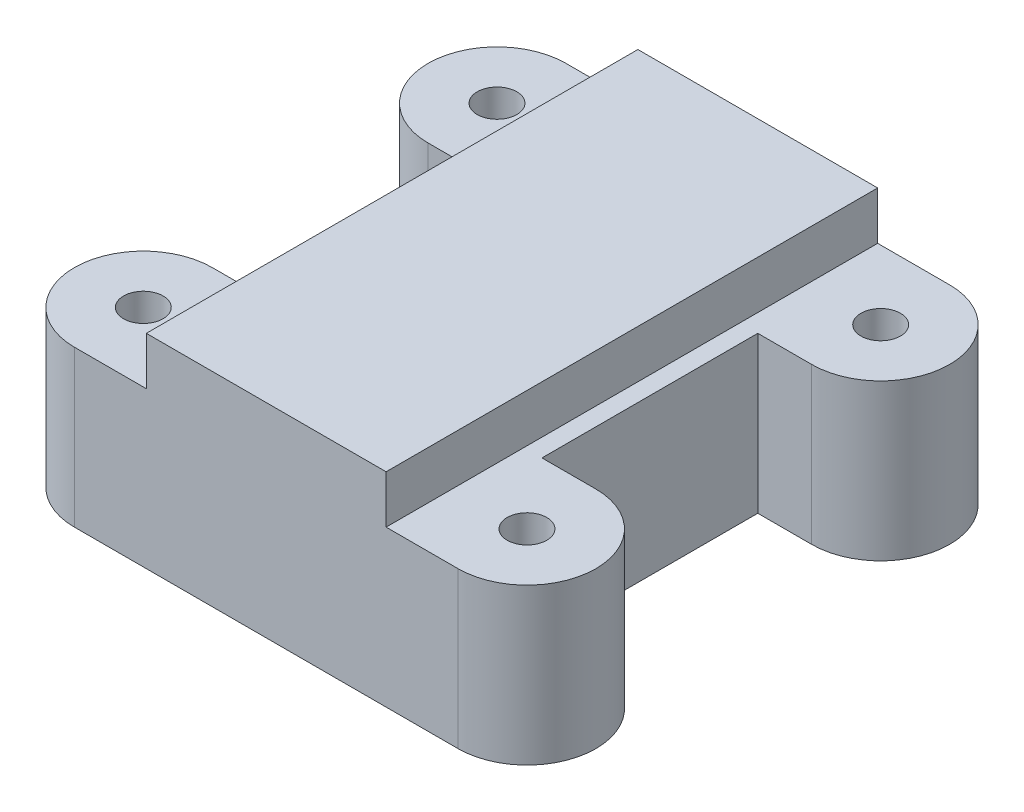
ISO-10303-21;
HEADER;
FILE_DESCRIPTION(('STEP AP214'),'2;1');
FILE_NAME('part.step','',(''),(''),'','','');
FILE_SCHEMA(('AUTOMOTIVE_DESIGN { 1 0 10303 214 1 1 1 1 }'));
ENDSEC;
DATA;
#1=APPLICATION_CONTEXT('core data for automotive mechanical design processes');
#2=APPLICATION_PROTOCOL_DEFINITION('international standard','automotive_design',2000,#1);
#3=PRODUCT_CONTEXT('',#1,'mechanical');
#4=PRODUCT('Part','Part','',(#3));
#5=PRODUCT_RELATED_PRODUCT_CATEGORY('part','',(#4));
#6=PRODUCT_DEFINITION_FORMATION('','',#4);
#7=PRODUCT_DEFINITION_CONTEXT('part definition',#1,'design');
#8=PRODUCT_DEFINITION('design','',#6,#7);
#9=PRODUCT_DEFINITION_SHAPE('','',#8);
#10=(LENGTH_UNIT() NAMED_UNIT(*) SI_UNIT(.MILLI.,.METRE.));
#11=(NAMED_UNIT(*) PLANE_ANGLE_UNIT() SI_UNIT($,.RADIAN.));
#12=(NAMED_UNIT(*) SI_UNIT($,.STERADIAN.) SOLID_ANGLE_UNIT());
#13=UNCERTAINTY_MEASURE_WITH_UNIT(LENGTH_MEASURE(1.E-05),#10,'distance_accuracy_value','');
#14=(GEOMETRIC_REPRESENTATION_CONTEXT(3) GLOBAL_UNCERTAINTY_ASSIGNED_CONTEXT((#13)) GLOBAL_UNIT_ASSIGNED_CONTEXT((#10,
#11,#12)) REPRESENTATION_CONTEXT('',''));
#15=CARTESIAN_POINT('',(0.,0.,0.));
#16=DIRECTION('',(0.,0.,1.));
#17=DIRECTION('',(1.,0.,0.));
#18=AXIS2_PLACEMENT_3D('',#15,#16,#17);
#19=CARTESIAN_POINT('',(-16.,13.,-14.75));
#20=DIRECTION('',(0.,-1.,0.));
#21=DIRECTION('',(0.,0.,-1.));
#22=AXIS2_PLACEMENT_3D('',#19,#20,#21);
#23=PLANE('',#22);
#24=CARTESIAN_POINT('',(-16.,13.,-14.75));
#25=DIRECTION('',(0.,1.,0.));
#26=DIRECTION('',(0.,0.,1.));
#27=AXIS2_PLACEMENT_3D('',#24,#25,#26);
#28=CIRCLE('',#27,1.65);
#29=CARTESIAN_POINT('',(-16.,13.,-16.4));
#30=VERTEX_POINT('',#29);
#31=EDGE_CURVE('E367',#30,#30,#28,.T.);
#32=ORIENTED_EDGE('',*,*,#31,.F.);
#33=EDGE_LOOP('',(#32));
#34=FACE_BOUND('',#33,.T.);
#35=CARTESIAN_POINT('',(-16.,13.,14.75));
#36=DIRECTION('',(0.,-1.,0.));
#37=DIRECTION('',(0.,0.,-1.));
#38=AXIS2_PLACEMENT_3D('',#35,#36,#37);
#39=CIRCLE('',#38,1.65);
#40=CARTESIAN_POINT('',(-16.,13.,13.1));
#41=VERTEX_POINT('',#40);
#42=EDGE_CURVE('E347',#41,#41,#39,.T.);
#43=ORIENTED_EDGE('',*,*,#42,.T.);
#44=EDGE_LOOP('',(#43));
#45=FACE_BOUND('',#44,.T.);
#46=DIRECTION('',(0.,0.,1.));
#47=VECTOR('',#46,1.);
#48=CARTESIAN_POINT('',(-10.,13.,-20.5));
#49=LINE('',#48,#47);
#50=CARTESIAN_POINT('',(-9.99999999999999,13.,-20.5));
#51=VERTEX_POINT('',#50);
#52=CARTESIAN_POINT('',(-9.99999999999999,13.,20.5));
#53=VERTEX_POINT('',#52);
#54=EDGE_CURVE('E209',#51,#53,#49,.T.);
#55=ORIENTED_EDGE('',*,*,#54,.F.);
#56=DIRECTION('',(1.,0.,0.));
#57=VECTOR('',#56,1.);
#58=CARTESIAN_POINT('',(-16.,13.,-20.5));
#59=LINE('',#58,#57);
#60=CARTESIAN_POINT('',(-16.,13.,-20.5));
#61=VERTEX_POINT('',#60);
#62=EDGE_CURVE('E313',#61,#51,#59,.T.);
#63=ORIENTED_EDGE('',*,*,#62,.F.);
#64=CARTESIAN_POINT('',(-16.,13.,-14.75));
#65=DIRECTION('',(0.,-1.,0.));
#66=DIRECTION('',(0.,0.,-1.));
#67=AXIS2_PLACEMENT_3D('',#64,#65,#66);
#68=CIRCLE('',#67,5.75);
#69=CARTESIAN_POINT('',(-16.,13.,-9.));
#70=VERTEX_POINT('',#69);
#71=EDGE_CURVE('E314',#70,#61,#68,.T.);
#72=ORIENTED_EDGE('',*,*,#71,.F.);
#73=DIRECTION('',(1.,0.,0.));
#74=VECTOR('',#73,1.);
#75=CARTESIAN_POINT('',(-16.,13.,-9.));
#76=LINE('',#75,#74);
#77=CARTESIAN_POINT('',(-11.5,13.,-9.));
#78=VERTEX_POINT('',#77);
#79=EDGE_CURVE('E379',#70,#78,#76,.T.);
#80=ORIENTED_EDGE('',*,*,#79,.T.);
#81=DIRECTION('',(0.,0.,1.));
#82=VECTOR('',#81,1.);
#83=CARTESIAN_POINT('',(-11.5,13.,-9.));
#84=LINE('',#83,#82);
#85=CARTESIAN_POINT('',(-11.5,13.,9.));
#86=VERTEX_POINT('',#85);
#87=EDGE_CURVE('E376',#78,#86,#84,.T.);
#88=ORIENTED_EDGE('',*,*,#87,.T.);
#89=DIRECTION('',(1.,0.,0.));
#90=VECTOR('',#89,1.);
#91=CARTESIAN_POINT('',(-16.,13.,9.));
#92=LINE('',#91,#90);
#93=CARTESIAN_POINT('',(-16.,13.,9.));
#94=VERTEX_POINT('',#93);
#95=EDGE_CURVE('E373',#94,#86,#92,.T.);
#96=ORIENTED_EDGE('',*,*,#95,.F.);
#97=CARTESIAN_POINT('',(-16.,13.,14.75));
#98=DIRECTION('',(0.,1.,0.));
#99=DIRECTION('',(0.,0.,1.));
#100=AXIS2_PLACEMENT_3D('',#97,#98,#99);
#101=CIRCLE('',#100,5.75);
#102=CARTESIAN_POINT('',(-16.,13.,20.5));
#103=VERTEX_POINT('',#102);
#104=EDGE_CURVE('E399',#94,#103,#101,.T.);
#105=ORIENTED_EDGE('',*,*,#104,.T.);
#106=DIRECTION('',(1.,0.,0.));
#107=VECTOR('',#106,1.);
#108=CARTESIAN_POINT('',(-16.,13.,20.5));
#109=LINE('',#108,#107);
#110=EDGE_CURVE('E392',#103,#53,#109,.T.);
#111=ORIENTED_EDGE('',*,*,#110,.T.);
#112=EDGE_LOOP('',(#55,#63,#72,#80,#88,#96,#105,#111));
#113=FACE_BOUND('',#112,.T.);
#114=ADVANCED_FACE('F192',(#34,#45,#113),#23,.F.);
#115=CARTESIAN_POINT('',(16.,13.,14.75));
#116=DIRECTION('',(0.,1.,0.));
#117=DIRECTION('',(0.,0.,1.));
#118=AXIS2_PLACEMENT_3D('',#115,#116,#117);
#119=CIRCLE('',#118,1.65);
#120=CARTESIAN_POINT('',(16.,13.,13.1));
#121=VERTEX_POINT('',#120);
#122=EDGE_CURVE('E355',#121,#121,#119,.T.);
#123=ORIENTED_EDGE('',*,*,#122,.F.);
#124=EDGE_LOOP('',(#123));
#125=FACE_BOUND('',#124,.T.);
#126=CARTESIAN_POINT('',(16.,13.,-14.75));
#127=DIRECTION('',(0.,-1.,0.));
#128=DIRECTION('',(0.,0.,-1.));
#129=AXIS2_PLACEMENT_3D('',#126,#127,#128);
#130=CIRCLE('',#129,1.65);
#131=CARTESIAN_POINT('',(16.,13.,-16.4));
#132=VERTEX_POINT('',#131);
#133=EDGE_CURVE('E361',#132,#132,#130,.T.);
#134=ORIENTED_EDGE('',*,*,#133,.T.);
#135=EDGE_LOOP('',(#134));
#136=FACE_BOUND('',#135,.T.);
#137=DIRECTION('',(0.,0.,-1.));
#138=VECTOR('',#137,1.);
#139=CARTESIAN_POINT('',(10.,13.,-20.5));
#140=LINE('',#139,#138);
#141=CARTESIAN_POINT('',(10.,13.,20.5));
#142=VERTEX_POINT('',#141);
#143=CARTESIAN_POINT('',(10.,13.,-20.5));
#144=VERTEX_POINT('',#143);
#145=EDGE_CURVE('E217',#142,#144,#140,.T.);
#146=ORIENTED_EDGE('',*,*,#145,.F.);
#147=CARTESIAN_POINT('',(16.,13.,20.5));
#148=VERTEX_POINT('',#147);
#149=EDGE_CURVE('E389',#142,#148,#109,.T.);
#150=ORIENTED_EDGE('',*,*,#149,.T.);
#151=CARTESIAN_POINT('',(16.,13.,14.75));
#152=DIRECTION('',(0.,-1.,0.));
#153=DIRECTION('',(0.,0.,-1.));
#154=AXIS2_PLACEMENT_3D('',#151,#152,#153);
#155=CIRCLE('',#154,5.75);
#156=CARTESIAN_POINT('',(16.,13.,8.99999999999999));
#157=VERTEX_POINT('',#156);
#158=EDGE_CURVE('E393',#157,#148,#155,.T.);
#159=ORIENTED_EDGE('',*,*,#158,.F.);
#160=DIRECTION('',(-1.,0.,0.));
#161=VECTOR('',#160,1.);
#162=CARTESIAN_POINT('',(16.,13.,9.));
#163=LINE('',#162,#161);
#164=CARTESIAN_POINT('',(11.5,13.,9.));
#165=VERTEX_POINT('',#164);
#166=EDGE_CURVE('E509',#157,#165,#163,.T.);
#167=ORIENTED_EDGE('',*,*,#166,.T.);
#168=DIRECTION('',(0.,0.,1.));
#169=VECTOR('',#168,1.);
#170=CARTESIAN_POINT('',(11.5,13.,-9.));
#171=LINE('',#170,#169);
#172=CARTESIAN_POINT('',(11.5,13.,-9.));
#173=VERTEX_POINT('',#172);
#174=EDGE_CURVE('E510',#173,#165,#171,.T.);
#175=ORIENTED_EDGE('',*,*,#174,.F.);
#176=DIRECTION('',(-1.,0.,0.));
#177=VECTOR('',#176,1.);
#178=CARTESIAN_POINT('',(16.,13.,-9.));
#179=LINE('',#178,#177);
#180=CARTESIAN_POINT('',(16.,13.,-9.));
#181=VERTEX_POINT('',#180);
#182=EDGE_CURVE('E495',#181,#173,#179,.T.);
#183=ORIENTED_EDGE('',*,*,#182,.F.);
#184=CARTESIAN_POINT('',(16.,13.,-14.75));
#185=DIRECTION('',(0.,1.,0.));
#186=DIRECTION('',(0.,0.,1.));
#187=AXIS2_PLACEMENT_3D('',#184,#185,#186);
#188=CIRCLE('',#187,5.75);
#189=CARTESIAN_POINT('',(16.,13.,-20.5));
#190=VERTEX_POINT('',#189);
#191=EDGE_CURVE('E310',#181,#190,#188,.T.);
#192=ORIENTED_EDGE('',*,*,#191,.T.);
#193=EDGE_CURVE('E305',#144,#190,#59,.T.);
#194=ORIENTED_EDGE('',*,*,#193,.F.);
#195=EDGE_LOOP('',(#146,#150,#159,#167,#175,#183,#192,#194));
#196=FACE_BOUND('',#195,.T.);
#197=ADVANCED_FACE('F307',(#125,#136,#196),#23,.F.);
#198=CARTESIAN_POINT('',(-16.,0.,-14.75));
#199=DIRECTION('',(0.,-1.,0.));
#200=DIRECTION('',(0.,0.,-1.));
#201=AXIS2_PLACEMENT_3D('',#198,#199,#200);
#202=PLANE('',#201);
#203=CARTESIAN_POINT('',(-16.,0.,14.75));
#204=DIRECTION('',(0.,-1.,0.));
#205=DIRECTION('',(0.,0.,-1.));
#206=AXIS2_PLACEMENT_3D('',#203,#204,#205);
#207=CIRCLE('',#206,1.65);
#208=CARTESIAN_POINT('',(-16.,0.,13.1));
#209=VERTEX_POINT('',#208);
#210=EDGE_CURVE('E351',#209,#209,#207,.T.);
#211=ORIENTED_EDGE('',*,*,#210,.F.);
#212=EDGE_LOOP('',(#211));
#213=FACE_BOUND('',#212,.T.);
#214=CARTESIAN_POINT('',(-16.,0.,-14.75));
#215=DIRECTION('',(0.,1.,0.));
#216=DIRECTION('',(0.,0.,1.));
#217=AXIS2_PLACEMENT_3D('',#214,#215,#216);
#218=CIRCLE('',#217,1.65);
#219=CARTESIAN_POINT('',(-16.,0.,-16.4));
#220=VERTEX_POINT('',#219);
#221=EDGE_CURVE('E364',#220,#220,#218,.T.);
#222=ORIENTED_EDGE('',*,*,#221,.T.);
#223=EDGE_LOOP('',(#222));
#224=FACE_BOUND('',#223,.T.);
#225=DIRECTION('',(1.,0.,0.));
#226=VECTOR('',#225,1.);
#227=CARTESIAN_POINT('',(-16.,0.,9.));
#228=LINE('',#227,#226);
#229=CARTESIAN_POINT('',(-16.,0.,9.));
#230=VERTEX_POINT('',#229);
#231=CARTESIAN_POINT('',(-11.5,0.,9.));
#232=VERTEX_POINT('',#231);
#233=EDGE_CURVE('E370',#230,#232,#228,.T.);
#234=ORIENTED_EDGE('',*,*,#233,.T.);
#235=DIRECTION('',(0.,0.,1.));
#236=VECTOR('',#235,1.);
#237=CARTESIAN_POINT('',(-11.5,0.,-9.));
#238=LINE('',#237,#236);
#239=CARTESIAN_POINT('',(-11.5,0.,-9.));
#240=VERTEX_POINT('',#239);
#241=EDGE_CURVE('E405',#240,#232,#238,.T.);
#242=ORIENTED_EDGE('',*,*,#241,.F.);
#243=DIRECTION('',(1.,0.,0.));
#244=VECTOR('',#243,1.);
#245=CARTESIAN_POINT('',(-16.,0.,-9.));
#246=LINE('',#245,#244);
#247=CARTESIAN_POINT('',(-16.,0.,-9.));
#248=VERTEX_POINT('',#247);
#249=EDGE_CURVE('E408',#248,#240,#246,.T.);
#250=ORIENTED_EDGE('',*,*,#249,.F.);
#251=CARTESIAN_POINT('',(-16.,0.,-14.75));
#252=DIRECTION('',(0.,-1.,0.));
#253=DIRECTION('',(0.,0.,-1.));
#254=AXIS2_PLACEMENT_3D('',#251,#252,#253);
#255=CIRCLE('',#254,5.75);
#256=CARTESIAN_POINT('',(-16.,0.,-20.5));
#257=VERTEX_POINT('',#256);
#258=EDGE_CURVE('E410',#248,#257,#255,.T.);
#259=ORIENTED_EDGE('',*,*,#258,.T.);
#260=DIRECTION('',(1.,0.,0.));
#261=VECTOR('',#260,1.);
#262=CARTESIAN_POINT('',(-16.,0.,-20.5));
#263=LINE('',#262,#261);
#264=CARTESIAN_POINT('',(16.,0.,-20.5));
#265=VERTEX_POINT('',#264);
#266=EDGE_CURVE('E413',#257,#265,#263,.T.);
#267=ORIENTED_EDGE('',*,*,#266,.T.);
#268=CARTESIAN_POINT('',(16.,0.,-14.75));
#269=DIRECTION('',(0.,1.,0.));
#270=DIRECTION('',(0.,0.,1.));
#271=AXIS2_PLACEMENT_3D('',#268,#269,#270);
#272=CIRCLE('',#271,5.75);
#273=CARTESIAN_POINT('',(16.,0.,-9.));
#274=VERTEX_POINT('',#273);
#275=EDGE_CURVE('E416',#274,#265,#272,.T.);
#276=ORIENTED_EDGE('',*,*,#275,.F.);
#277=DIRECTION('',(-1.,0.,0.));
#278=VECTOR('',#277,1.);
#279=CARTESIAN_POINT('',(16.,0.,-9.));
#280=LINE('',#279,#278);
#281=CARTESIAN_POINT('',(11.5,0.,-9.));
#282=VERTEX_POINT('',#281);
#283=EDGE_CURVE('E419',#274,#282,#280,.T.);
#284=ORIENTED_EDGE('',*,*,#283,.T.);
#285=DIRECTION('',(0.,0.,1.));
#286=VECTOR('',#285,1.);
#287=CARTESIAN_POINT('',(11.5,0.,-9.));
#288=LINE('',#287,#286);
#289=CARTESIAN_POINT('',(11.5,0.,9.));
#290=VERTEX_POINT('',#289);
#291=EDGE_CURVE('E422',#282,#290,#288,.T.);
#292=ORIENTED_EDGE('',*,*,#291,.T.);
#293=DIRECTION('',(-1.,0.,0.));
#294=VECTOR('',#293,1.);
#295=CARTESIAN_POINT('',(16.,0.,9.));
#296=LINE('',#295,#294);
#297=CARTESIAN_POINT('',(16.,0.,8.99999999999999));
#298=VERTEX_POINT('',#297);
#299=EDGE_CURVE('E425',#298,#290,#296,.T.);
#300=ORIENTED_EDGE('',*,*,#299,.F.);
#301=CARTESIAN_POINT('',(16.,0.,14.75));
#302=DIRECTION('',(0.,-1.,0.));
#303=DIRECTION('',(0.,0.,-1.));
#304=AXIS2_PLACEMENT_3D('',#301,#302,#303);
#305=CIRCLE('',#304,5.75);
#306=CARTESIAN_POINT('',(16.,0.,20.5));
#307=VERTEX_POINT('',#306);
#308=EDGE_CURVE('E428',#298,#307,#305,.T.);
#309=ORIENTED_EDGE('',*,*,#308,.T.);
#310=DIRECTION('',(1.,0.,0.));
#311=VECTOR('',#310,1.);
#312=CARTESIAN_POINT('',(-16.,0.,20.5));
#313=LINE('',#312,#311);
#314=CARTESIAN_POINT('',(-16.,0.,20.5));
#315=VERTEX_POINT('',#314);
#316=EDGE_CURVE('E431',#315,#307,#313,.T.);
#317=ORIENTED_EDGE('',*,*,#316,.F.);
#318=CARTESIAN_POINT('',(-16.,0.,14.75));
#319=DIRECTION('',(0.,1.,0.));
#320=DIRECTION('',(0.,0.,1.));
#321=AXIS2_PLACEMENT_3D('',#318,#319,#320);
#322=CIRCLE('',#321,5.75);
#323=EDGE_CURVE('E377',#230,#315,#322,.T.);
#324=ORIENTED_EDGE('',*,*,#323,.F.);
#325=EDGE_LOOP('',(#234,#242,#250,#259,#267,#276,#284,#292,#300,#309,#317,#324));
#326=FACE_BOUND('',#325,.T.);
#327=CARTESIAN_POINT('',(16.,0.,-14.75));
#328=DIRECTION('',(0.,-1.,0.));
#329=DIRECTION('',(0.,0.,-1.));
#330=AXIS2_PLACEMENT_3D('',#327,#328,#329);
#331=CIRCLE('',#330,1.65);
#332=CARTESIAN_POINT('',(16.,0.,-16.4));
#333=VERTEX_POINT('',#332);
#334=EDGE_CURVE('E358',#333,#333,#331,.T.);
#335=ORIENTED_EDGE('',*,*,#334,.F.);
#336=EDGE_LOOP('',(#335));
#337=FACE_BOUND('',#336,.T.);
#338=CARTESIAN_POINT('',(16.,0.,14.75));
#339=DIRECTION('',(0.,1.,0.));
#340=DIRECTION('',(0.,0.,1.));
#341=AXIS2_PLACEMENT_3D('',#338,#339,#340);
#342=CIRCLE('',#341,1.65);
#343=CARTESIAN_POINT('',(16.,0.,13.1));
#344=VERTEX_POINT('',#343);
#345=EDGE_CURVE('E350',#344,#344,#342,.T.);
#346=ORIENTED_EDGE('',*,*,#345,.T.);
#347=EDGE_LOOP('',(#346));
#348=FACE_BOUND('',#347,.T.);
#349=ADVANCED_FACE('F467',(#213,#224,#326,#337,#348),#202,.T.);
#350=CARTESIAN_POINT('',(-16.,13.,9.));
#351=DIRECTION('',(0.,0.,-1.));
#352=DIRECTION('',(-1.,0.,0.));
#353=AXIS2_PLACEMENT_3D('',#350,#351,#352);
#354=PLANE('',#353);
#355=ORIENTED_EDGE('',*,*,#233,.F.);
#356=DIRECTION('',(0.,-1.,0.));
#357=VECTOR('',#356,1.);
#358=CARTESIAN_POINT('',(-16.,13.,9.));
#359=LINE('',#358,#357);
#360=EDGE_CURVE('E13',#94,#230,#359,.T.);
#361=ORIENTED_EDGE('',*,*,#360,.F.);
#362=ORIENTED_EDGE('',*,*,#95,.T.);
#363=DIRECTION('',(0.,-1.,0.));
#364=VECTOR('',#363,1.);
#365=CARTESIAN_POINT('',(-11.5,13.,9.));
#366=LINE('',#365,#364);
#367=EDGE_CURVE('E402',#86,#232,#366,.T.);
#368=ORIENTED_EDGE('',*,*,#367,.T.);
#369=EDGE_LOOP('',(#355,#361,#362,#368));
#370=FACE_BOUND('',#369,.T.);
#371=ADVANCED_FACE('F194',(#370),#354,.T.);
#372=CARTESIAN_POINT('',(-16.,13.,14.75));
#373=DIRECTION('',(0.,-1.,0.));
#374=DIRECTION('',(0.,0.,-1.));
#375=AXIS2_PLACEMENT_3D('',#372,#373,#374);
#376=CYLINDRICAL_SURFACE('',#375,5.75);
#377=ORIENTED_EDGE('',*,*,#323,.T.);
#378=DIRECTION('',(0.,-1.,0.));
#379=VECTOR('',#378,1.);
#380=CARTESIAN_POINT('',(-16.,13.,20.5));
#381=LINE('',#380,#379);
#382=EDGE_CURVE('E201',#103,#315,#381,.T.);
#383=ORIENTED_EDGE('',*,*,#382,.F.);
#384=ORIENTED_EDGE('',*,*,#104,.F.);
#385=ORIENTED_EDGE('',*,*,#360,.T.);
#386=EDGE_LOOP('',(#377,#383,#384,#385));
#387=FACE_BOUND('',#386,.T.);
#388=ADVANCED_FACE('F472',(#387),#376,.T.);
#389=CARTESIAN_POINT('',(-16.,13.,20.5));
#390=DIRECTION('',(0.,0.,-1.));
#391=DIRECTION('',(-1.,0.,0.));
#392=AXIS2_PLACEMENT_3D('',#389,#390,#391);
#393=PLANE('',#392);
#394=ORIENTED_EDGE('',*,*,#316,.T.);
#395=DIRECTION('',(0.,-1.,0.));
#396=VECTOR('',#395,1.);
#397=CARTESIAN_POINT('',(16.,13.,20.5));
#398=LINE('',#397,#396);
#399=EDGE_CURVE('E437',#148,#307,#398,.T.);
#400=ORIENTED_EDGE('',*,*,#399,.F.);
#401=ORIENTED_EDGE('',*,*,#149,.F.);
#402=DIRECTION('',(0.,-1.,0.));
#403=VECTOR('',#402,1.);
#404=CARTESIAN_POINT('',(10.,79.6179789118282,20.5));
#405=LINE('',#404,#403);
#406=CARTESIAN_POINT('',(10.,17.,20.5));
#407=VERTEX_POINT('',#406);
#408=EDGE_CURVE('E325',#407,#142,#405,.T.);
#409=ORIENTED_EDGE('',*,*,#408,.F.);
#410=DIRECTION('',(-1.,0.,0.));
#411=VECTOR('',#410,1.);
#412=CARTESIAN_POINT('',(-9.99999999999999,17.,20.5));
#413=LINE('',#412,#411);
#414=CARTESIAN_POINT('',(-9.99999999999999,17.,20.5));
#415=VERTEX_POINT('',#414);
#416=EDGE_CURVE('E709',#407,#415,#413,.T.);
#417=ORIENTED_EDGE('',*,*,#416,.T.);
#418=DIRECTION('',(0.,-1.,0.));
#419=VECTOR('',#418,1.);
#420=CARTESIAN_POINT('',(-9.99999999999999,79.6179789118282,20.5));
#421=LINE('',#420,#419);
#422=EDGE_CURVE('E346',#415,#53,#421,.T.);
#423=ORIENTED_EDGE('',*,*,#422,.T.);
#424=ORIENTED_EDGE('',*,*,#110,.F.);
#425=ORIENTED_EDGE('',*,*,#382,.T.);
#426=EDGE_LOOP('',(#394,#400,#401,#409,#417,#423,#424,#425));
#427=FACE_BOUND('',#426,.T.);
#428=ADVANCED_FACE('F476',(#427),#393,.F.);
#429=CARTESIAN_POINT('',(16.,13.,14.75));
#430=DIRECTION('',(0.,-1.,0.));
#431=DIRECTION('',(0.,0.,-1.));
#432=AXIS2_PLACEMENT_3D('',#429,#430,#431);
#433=CYLINDRICAL_SURFACE('',#432,5.75);
#434=ORIENTED_EDGE('',*,*,#308,.F.);
#435=DIRECTION('',(0.,-1.,0.));
#436=VECTOR('',#435,1.);
#437=CARTESIAN_POINT('',(16.,13.,8.99999999999999));
#438=LINE('',#437,#436);
#439=EDGE_CURVE('E439',#157,#298,#438,.T.);
#440=ORIENTED_EDGE('',*,*,#439,.F.);
#441=ORIENTED_EDGE('',*,*,#158,.T.);
#442=ORIENTED_EDGE('',*,*,#399,.T.);
#443=EDGE_LOOP('',(#434,#440,#441,#442));
#444=FACE_BOUND('',#443,.T.);
#445=ADVANCED_FACE('F505',(#444),#433,.T.);
#446=CARTESIAN_POINT('',(16.,13.,9.));
#447=DIRECTION('',(0.,0.,1.));
#448=DIRECTION('',(1.,0.,0.));
#449=AXIS2_PLACEMENT_3D('',#446,#447,#448);
#450=PLANE('',#449);
#451=ORIENTED_EDGE('',*,*,#299,.T.);
#452=DIRECTION('',(0.,-1.,0.));
#453=VECTOR('',#452,1.);
#454=CARTESIAN_POINT('',(11.5,13.,9.));
#455=LINE('',#454,#453);
#456=EDGE_CURVE('E441',#165,#290,#455,.T.);
#457=ORIENTED_EDGE('',*,*,#456,.F.);
#458=ORIENTED_EDGE('',*,*,#166,.F.);
#459=ORIENTED_EDGE('',*,*,#439,.T.);
#460=EDGE_LOOP('',(#451,#457,#458,#459));
#461=FACE_BOUND('',#460,.T.);
#462=ADVANCED_FACE('F512',(#461),#450,.F.);
#463=CARTESIAN_POINT('',(11.5,13.,-9.));
#464=DIRECTION('',(1.,0.,0.));
#465=DIRECTION('',(0.,0.,-1.));
#466=AXIS2_PLACEMENT_3D('',#463,#464,#465);
#467=PLANE('',#466);
#468=ORIENTED_EDGE('',*,*,#291,.F.);
#469=DIRECTION('',(0.,-1.,0.));
#470=VECTOR('',#469,1.);
#471=CARTESIAN_POINT('',(11.5,13.,-9.));
#472=LINE('',#471,#470);
#473=EDGE_CURVE('E443',#173,#282,#472,.T.);
#474=ORIENTED_EDGE('',*,*,#473,.F.);
#475=ORIENTED_EDGE('',*,*,#174,.T.);
#476=ORIENTED_EDGE('',*,*,#456,.T.);
#477=EDGE_LOOP('',(#468,#474,#475,#476));
#478=FACE_BOUND('',#477,.T.);
#479=ADVANCED_FACE('F499',(#478),#467,.T.);
#480=CARTESIAN_POINT('',(16.,13.,-9.));
#481=DIRECTION('',(0.,0.,1.));
#482=DIRECTION('',(1.,0.,0.));
#483=AXIS2_PLACEMENT_3D('',#480,#481,#482);
#484=PLANE('',#483);
#485=ORIENTED_EDGE('',*,*,#283,.F.);
#486=DIRECTION('',(0.,-1.,0.));
#487=VECTOR('',#486,1.);
#488=CARTESIAN_POINT('',(16.,13.,-9.));
#489=LINE('',#488,#487);
#490=EDGE_CURVE('E445',#181,#274,#489,.T.);
#491=ORIENTED_EDGE('',*,*,#490,.F.);
#492=ORIENTED_EDGE('',*,*,#182,.T.);
#493=ORIENTED_EDGE('',*,*,#473,.T.);
#494=EDGE_LOOP('',(#485,#491,#492,#493));
#495=FACE_BOUND('',#494,.T.);
#496=ADVANCED_FACE('F492',(#495),#484,.T.);
#497=CARTESIAN_POINT('',(16.,13.,-14.75));
#498=DIRECTION('',(0.,-1.,0.));
#499=DIRECTION('',(0.,0.,-1.));
#500=AXIS2_PLACEMENT_3D('',#497,#498,#499);
#501=CYLINDRICAL_SURFACE('',#500,5.75);
#502=ORIENTED_EDGE('',*,*,#275,.T.);
#503=DIRECTION('',(0.,-1.,0.));
#504=VECTOR('',#503,1.);
#505=CARTESIAN_POINT('',(16.,13.,-20.5));
#506=LINE('',#505,#504);
#507=EDGE_CURVE('E447',#190,#265,#506,.T.);
#508=ORIENTED_EDGE('',*,*,#507,.F.);
#509=ORIENTED_EDGE('',*,*,#191,.F.);
#510=ORIENTED_EDGE('',*,*,#490,.T.);
#511=EDGE_LOOP('',(#502,#508,#509,#510));
#512=FACE_BOUND('',#511,.T.);
#513=ADVANCED_FACE('F574',(#512),#501,.T.);
#514=CARTESIAN_POINT('',(-16.,13.,-20.5));
#515=DIRECTION('',(0.,0.,-1.));
#516=DIRECTION('',(-1.,0.,0.));
#517=AXIS2_PLACEMENT_3D('',#514,#515,#516);
#518=PLANE('',#517);
#519=ORIENTED_EDGE('',*,*,#266,.F.);
#520=DIRECTION('',(0.,-1.,0.));
#521=VECTOR('',#520,1.);
#522=CARTESIAN_POINT('',(-16.,13.,-20.5));
#523=LINE('',#522,#521);
#524=EDGE_CURVE('E449',#61,#257,#523,.T.);
#525=ORIENTED_EDGE('',*,*,#524,.F.);
#526=ORIENTED_EDGE('',*,*,#62,.T.);
#527=DIRECTION('',(0.,-1.,0.));
#528=VECTOR('',#527,1.);
#529=CARTESIAN_POINT('',(-10.,79.6179789118282,-20.5));
#530=LINE('',#529,#528);
#531=CARTESIAN_POINT('',(-10.,17.,-20.5));
#532=VERTEX_POINT('',#531);
#533=EDGE_CURVE('E326',#532,#51,#530,.T.);
#534=ORIENTED_EDGE('',*,*,#533,.F.);
#535=DIRECTION('',(1.,0.,0.));
#536=VECTOR('',#535,1.);
#537=CARTESIAN_POINT('',(-10.,17.,-20.5));
#538=LINE('',#537,#536);
#539=CARTESIAN_POINT('',(10.,17.,-20.5));
#540=VERTEX_POINT('',#539);
#541=EDGE_CURVE('E322',#532,#540,#538,.T.);
#542=ORIENTED_EDGE('',*,*,#541,.T.);
#543=DIRECTION('',(0.,-1.,0.));
#544=VECTOR('',#543,1.);
#545=CARTESIAN_POINT('',(10.,79.6179789118282,-20.5));
#546=LINE('',#545,#544);
#547=EDGE_CURVE('E318',#540,#144,#546,.T.);
#548=ORIENTED_EDGE('',*,*,#547,.T.);
#549=ORIENTED_EDGE('',*,*,#193,.T.);
#550=ORIENTED_EDGE('',*,*,#507,.T.);
#551=EDGE_LOOP('',(#519,#525,#526,#534,#542,#548,#549,#550));
#552=FACE_BOUND('',#551,.T.);
#553=ADVANCED_FACE('F320',(#552),#518,.T.);
#554=CARTESIAN_POINT('',(-16.,13.,-14.75));
#555=DIRECTION('',(0.,-1.,0.));
#556=DIRECTION('',(0.,0.,-1.));
#557=AXIS2_PLACEMENT_3D('',#554,#555,#556);
#558=CYLINDRICAL_SURFACE('',#557,5.75);
#559=ORIENTED_EDGE('',*,*,#258,.F.);
#560=DIRECTION('',(0.,-1.,0.));
#561=VECTOR('',#560,1.);
#562=CARTESIAN_POINT('',(-16.,13.,-9.));
#563=LINE('',#562,#561);
#564=EDGE_CURVE('E451',#70,#248,#563,.T.);
#565=ORIENTED_EDGE('',*,*,#564,.F.);
#566=ORIENTED_EDGE('',*,*,#71,.T.);
#567=ORIENTED_EDGE('',*,*,#524,.T.);
#568=EDGE_LOOP('',(#559,#565,#566,#567));
#569=FACE_BOUND('',#568,.T.);
#570=ADVANCED_FACE('F487',(#569),#558,.T.);
#571=CARTESIAN_POINT('',(-16.,13.,-9.));
#572=DIRECTION('',(0.,0.,-1.));
#573=DIRECTION('',(-1.,0.,0.));
#574=AXIS2_PLACEMENT_3D('',#571,#572,#573);
#575=PLANE('',#574);
#576=ORIENTED_EDGE('',*,*,#249,.T.);
#577=DIRECTION('',(0.,-1.,0.));
#578=VECTOR('',#577,1.);
#579=CARTESIAN_POINT('',(-11.5,13.,-9.));
#580=LINE('',#579,#578);
#581=EDGE_CURVE('E453',#78,#240,#580,.T.);
#582=ORIENTED_EDGE('',*,*,#581,.F.);
#583=ORIENTED_EDGE('',*,*,#79,.F.);
#584=ORIENTED_EDGE('',*,*,#564,.T.);
#585=EDGE_LOOP('',(#576,#582,#583,#584));
#586=FACE_BOUND('',#585,.T.);
#587=ADVANCED_FACE('F484',(#586),#575,.F.);
#588=CARTESIAN_POINT('',(-11.5,13.,-9.));
#589=DIRECTION('',(1.,0.,0.));
#590=DIRECTION('',(0.,0.,-1.));
#591=AXIS2_PLACEMENT_3D('',#588,#589,#590);
#592=PLANE('',#591);
#593=ORIENTED_EDGE('',*,*,#241,.T.);
#594=ORIENTED_EDGE('',*,*,#367,.F.);
#595=ORIENTED_EDGE('',*,*,#87,.F.);
#596=ORIENTED_EDGE('',*,*,#581,.T.);
#597=EDGE_LOOP('',(#593,#594,#595,#596));
#598=FACE_BOUND('',#597,.T.);
#599=ADVANCED_FACE('F462',(#598),#592,.F.);
#600=CARTESIAN_POINT('',(-16.,13.,-14.75));
#601=DIRECTION('',(0.,-1.,0.));
#602=DIRECTION('',(0.,0.,-1.));
#603=AXIS2_PLACEMENT_3D('',#600,#601,#602);
#604=CYLINDRICAL_SURFACE('',#603,1.65);
#605=CARTESIAN_POINT('',(-16.,13.,-16.4));
#606=CARTESIAN_POINT('',(-16.,12.8645833333333,-16.4));
#607=CARTESIAN_POINT('',(-16.,12.7291666666667,-16.4));
#608=CARTESIAN_POINT('',(-16.,12.4583333333333,-16.4));
#609=CARTESIAN_POINT('',(-16.,12.3229166666667,-16.4));
#610=CARTESIAN_POINT('',(-16.,12.0520833333333,-16.4));
#611=CARTESIAN_POINT('',(-16.,11.9166666666667,-16.4));
#612=CARTESIAN_POINT('',(-16.,11.6458333333333,-16.4));
#613=CARTESIAN_POINT('',(-16.,11.5104166666667,-16.4));
#614=CARTESIAN_POINT('',(-16.,11.2395833333333,-16.4));
#615=CARTESIAN_POINT('',(-16.,11.1041666666667,-16.4));
#616=CARTESIAN_POINT('',(-16.,10.8333333333333,-16.4));
#617=CARTESIAN_POINT('',(-16.,10.6979166666667,-16.4));
#618=CARTESIAN_POINT('',(-16.,10.4270833333333,-16.4));
#619=CARTESIAN_POINT('',(-16.,10.2916666666667,-16.4));
#620=CARTESIAN_POINT('',(-16.,10.0208333333333,-16.4));
#621=CARTESIAN_POINT('',(-16.,9.88541666666667,-16.4));
#622=CARTESIAN_POINT('',(-16.,9.61458333333333,-16.4));
#623=CARTESIAN_POINT('',(-16.,9.47916666666667,-16.4));
#624=CARTESIAN_POINT('',(-16.,9.20833333333333,-16.4));
#625=CARTESIAN_POINT('',(-16.,9.07291666666667,-16.4));
#626=CARTESIAN_POINT('',(-16.,8.80208333333333,-16.4));
#627=CARTESIAN_POINT('',(-16.,8.66666666666667,-16.4));
#628=CARTESIAN_POINT('',(-16.,8.39583333333333,-16.4));
#629=CARTESIAN_POINT('',(-16.,8.26041666666667,-16.4));
#630=CARTESIAN_POINT('',(-16.,7.98958333333333,-16.4));
#631=CARTESIAN_POINT('',(-16.,7.85416666666667,-16.4));
#632=CARTESIAN_POINT('',(-16.,7.58333333333333,-16.4));
#633=CARTESIAN_POINT('',(-16.,7.44791666666667,-16.4));
#634=CARTESIAN_POINT('',(-16.,7.17708333333333,-16.4));
#635=CARTESIAN_POINT('',(-16.,7.04166666666667,-16.4));
#636=CARTESIAN_POINT('',(-16.,6.77083333333333,-16.4));
#637=CARTESIAN_POINT('',(-16.,6.63541666666667,-16.4));
#638=CARTESIAN_POINT('',(-16.,6.36458333333333,-16.4));
#639=CARTESIAN_POINT('',(-16.,6.22916666666667,-16.4));
#640=CARTESIAN_POINT('',(-16.,5.95833333333333,-16.4));
#641=CARTESIAN_POINT('',(-16.,5.82291666666667,-16.4));
#642=CARTESIAN_POINT('',(-16.,5.55208333333333,-16.4));
#643=CARTESIAN_POINT('',(-16.,5.41666666666667,-16.4));
#644=CARTESIAN_POINT('',(-16.,5.14583333333333,-16.4));
#645=CARTESIAN_POINT('',(-16.,5.01041666666667,-16.4));
#646=CARTESIAN_POINT('',(-16.,4.73958333333333,-16.4));
#647=CARTESIAN_POINT('',(-16.,4.60416666666667,-16.4));
#648=CARTESIAN_POINT('',(-16.,4.33333333333333,-16.4));
#649=CARTESIAN_POINT('',(-16.,4.19791666666667,-16.4));
#650=CARTESIAN_POINT('',(-16.,3.92708333333333,-16.4));
#651=CARTESIAN_POINT('',(-16.,3.79166666666667,-16.4));
#652=CARTESIAN_POINT('',(-16.,3.52083333333333,-16.4));
#653=CARTESIAN_POINT('',(-16.,3.38541666666667,-16.4));
#654=CARTESIAN_POINT('',(-16.,3.11458333333333,-16.4));
#655=CARTESIAN_POINT('',(-16.,2.97916666666667,-16.4));
#656=CARTESIAN_POINT('',(-16.,2.70833333333333,-16.4));
#657=CARTESIAN_POINT('',(-16.,2.57291666666667,-16.4));
#658=CARTESIAN_POINT('',(-16.,2.30208333333333,-16.4));
#659=CARTESIAN_POINT('',(-16.,2.16666666666667,-16.4));
#660=CARTESIAN_POINT('',(-16.,1.89583333333333,-16.4));
#661=CARTESIAN_POINT('',(-16.,1.76041666666667,-16.4));
#662=CARTESIAN_POINT('',(-16.,1.48958333333333,-16.4));
#663=CARTESIAN_POINT('',(-16.,1.35416666666667,-16.4));
#664=CARTESIAN_POINT('',(-16.,1.08333333333333,-16.4));
#665=CARTESIAN_POINT('',(-16.,0.947916666666667,-16.4));
#666=CARTESIAN_POINT('',(-16.,0.677083333333334,-16.4));
#667=CARTESIAN_POINT('',(-16.,0.541666666666667,-16.4));
#668=CARTESIAN_POINT('',(-16.,0.270833333333334,-16.4));
#669=CARTESIAN_POINT('',(-16.,0.135416666666667,-16.4));
#670=CARTESIAN_POINT('',(-16.,0.,-16.4));
#671=B_SPLINE_CURVE_WITH_KNOTS('',3,(#605,#606,#607,#608,#609,#610,#611,#612,#613,#614,#615,
#616,#617,#618,#619,#620,#621,#622,#623,#624,#625,#626,#627,#628,#629,#630,#631,#632,#633,#634,
#635,#636,#637,#638,#639,#640,#641,#642,#643,#644,#645,#646,#647,#648,#649,#650,#651,#652,#653,
#654,#655,#656,#657,#658,#659,#660,#661,#662,#663,#664,#665,#666,#667,#668,#669,#670),
.UNSPECIFIED.,.F.,.F.,(4,2,2,2,2,2,2,2,2,2,2,2,2,2,2,2,2,2,2,2,2,2,2,2,2,2,2,2,2,2,2,2,4),(0.,
0.406249999999999,0.812499999999999,1.21875,1.625,2.03125,2.4375,2.84375,3.25,3.65625,4.0625,
4.46875,4.875,5.28125,5.6875,6.09375,6.5,6.90625,7.3125,7.71875,8.125,8.53125,8.9375,9.34375,
9.75,10.15625,10.5625,10.96875,11.375,11.78125,12.1875,12.59375,13.),.UNSPECIFIED.);
#672=EDGE_CURVE('BSEAM532',#30,#220,#671,.T.);
#673=ORIENTED_EDGE('',*,*,#31,.T.);
#674=ORIENTED_EDGE('',*,*,#221,.F.);
#675=ORIENTED_EDGE('',*,*,#672,.T.);
#676=ORIENTED_EDGE('',*,*,#672,.F.);
#677=EDGE_LOOP('',(#673,#675,#674,#676));
#678=FACE_BOUND('',#677,.T.);
#679=ADVANCED_FACE('F532',(#678),#604,.F.);
#680=CARTESIAN_POINT('',(16.,13.,-14.75));
#681=DIRECTION('',(0.,-1.,0.));
#682=DIRECTION('',(0.,0.,-1.));
#683=AXIS2_PLACEMENT_3D('',#680,#681,#682);
#684=CYLINDRICAL_SURFACE('',#683,1.65);
#685=CARTESIAN_POINT('',(16.,13.,-16.4));
#686=CARTESIAN_POINT('',(16.,12.8645833333333,-16.4));
#687=CARTESIAN_POINT('',(16.,12.7291666666667,-16.4));
#688=CARTESIAN_POINT('',(16.,12.4583333333333,-16.4));
#689=CARTESIAN_POINT('',(16.,12.3229166666667,-16.4));
#690=CARTESIAN_POINT('',(16.,12.0520833333333,-16.4));
#691=CARTESIAN_POINT('',(16.,11.9166666666667,-16.4));
#692=CARTESIAN_POINT('',(16.,11.6458333333333,-16.4));
#693=CARTESIAN_POINT('',(16.,11.5104166666667,-16.4));
#694=CARTESIAN_POINT('',(16.,11.2395833333333,-16.4));
#695=CARTESIAN_POINT('',(16.,11.1041666666667,-16.4));
#696=CARTESIAN_POINT('',(16.,10.8333333333333,-16.4));
#697=CARTESIAN_POINT('',(16.,10.6979166666667,-16.4));
#698=CARTESIAN_POINT('',(16.,10.4270833333333,-16.4));
#699=CARTESIAN_POINT('',(16.,10.2916666666667,-16.4));
#700=CARTESIAN_POINT('',(16.,10.0208333333333,-16.4));
#701=CARTESIAN_POINT('',(16.,9.88541666666667,-16.4));
#702=CARTESIAN_POINT('',(16.,9.61458333333333,-16.4));
#703=CARTESIAN_POINT('',(16.,9.47916666666667,-16.4));
#704=CARTESIAN_POINT('',(16.,9.20833333333333,-16.4));
#705=CARTESIAN_POINT('',(16.,9.07291666666667,-16.4));
#706=CARTESIAN_POINT('',(16.,8.80208333333333,-16.4));
#707=CARTESIAN_POINT('',(16.,8.66666666666667,-16.4));
#708=CARTESIAN_POINT('',(16.,8.39583333333333,-16.4));
#709=CARTESIAN_POINT('',(16.,8.26041666666667,-16.4));
#710=CARTESIAN_POINT('',(16.,7.98958333333333,-16.4));
#711=CARTESIAN_POINT('',(16.,7.85416666666667,-16.4));
#712=CARTESIAN_POINT('',(16.,7.58333333333333,-16.4));
#713=CARTESIAN_POINT('',(16.,7.44791666666667,-16.4));
#714=CARTESIAN_POINT('',(16.,7.17708333333333,-16.4));
#715=CARTESIAN_POINT('',(16.,7.04166666666667,-16.4));
#716=CARTESIAN_POINT('',(16.,6.77083333333333,-16.4));
#717=CARTESIAN_POINT('',(16.,6.63541666666667,-16.4));
#718=CARTESIAN_POINT('',(16.,6.36458333333333,-16.4));
#719=CARTESIAN_POINT('',(16.,6.22916666666667,-16.4));
#720=CARTESIAN_POINT('',(16.,5.95833333333333,-16.4));
#721=CARTESIAN_POINT('',(16.,5.82291666666667,-16.4));
#722=CARTESIAN_POINT('',(16.,5.55208333333333,-16.4));
#723=CARTESIAN_POINT('',(16.,5.41666666666667,-16.4));
#724=CARTESIAN_POINT('',(16.,5.14583333333333,-16.4));
#725=CARTESIAN_POINT('',(16.,5.01041666666667,-16.4));
#726=CARTESIAN_POINT('',(16.,4.73958333333333,-16.4));
#727=CARTESIAN_POINT('',(16.,4.60416666666667,-16.4));
#728=CARTESIAN_POINT('',(16.,4.33333333333333,-16.4));
#729=CARTESIAN_POINT('',(16.,4.19791666666667,-16.4));
#730=CARTESIAN_POINT('',(16.,3.92708333333333,-16.4));
#731=CARTESIAN_POINT('',(16.,3.79166666666667,-16.4));
#732=CARTESIAN_POINT('',(16.,3.52083333333333,-16.4));
#733=CARTESIAN_POINT('',(16.,3.38541666666667,-16.4));
#734=CARTESIAN_POINT('',(16.,3.11458333333333,-16.4));
#735=CARTESIAN_POINT('',(16.,2.97916666666667,-16.4));
#736=CARTESIAN_POINT('',(16.,2.70833333333333,-16.4));
#737=CARTESIAN_POINT('',(16.,2.57291666666667,-16.4));
#738=CARTESIAN_POINT('',(16.,2.30208333333333,-16.4));
#739=CARTESIAN_POINT('',(16.,2.16666666666667,-16.4));
#740=CARTESIAN_POINT('',(16.,1.89583333333333,-16.4));
#741=CARTESIAN_POINT('',(16.,1.76041666666667,-16.4));
#742=CARTESIAN_POINT('',(16.,1.48958333333333,-16.4));
#743=CARTESIAN_POINT('',(16.,1.35416666666667,-16.4));
#744=CARTESIAN_POINT('',(16.,1.08333333333333,-16.4));
#745=CARTESIAN_POINT('',(16.,0.947916666666667,-16.4));
#746=CARTESIAN_POINT('',(16.,0.677083333333334,-16.4));
#747=CARTESIAN_POINT('',(16.,0.541666666666667,-16.4));
#748=CARTESIAN_POINT('',(16.,0.270833333333334,-16.4));
#749=CARTESIAN_POINT('',(16.,0.135416666666667,-16.4));
#750=CARTESIAN_POINT('',(16.,0.,-16.4));
#751=B_SPLINE_CURVE_WITH_KNOTS('',3,(#685,#686,#687,#688,#689,#690,#691,#692,#693,#694,#695,
#696,#697,#698,#699,#700,#701,#702,#703,#704,#705,#706,#707,#708,#709,#710,#711,#712,#713,#714,
#715,#716,#717,#718,#719,#720,#721,#722,#723,#724,#725,#726,#727,#728,#729,#730,#731,#732,#733,
#734,#735,#736,#737,#738,#739,#740,#741,#742,#743,#744,#745,#746,#747,#748,#749,#750),
.UNSPECIFIED.,.F.,.F.,(4,2,2,2,2,2,2,2,2,2,2,2,2,2,2,2,2,2,2,2,2,2,2,2,2,2,2,2,2,2,2,2,4),(0.,
0.406249999999999,0.812499999999999,1.21875,1.625,2.03125,2.4375,2.84375,3.25,3.65625,4.0625,
4.46875,4.875,5.28125,5.6875,6.09375,6.5,6.90625,7.3125,7.71875,8.125,8.53125,8.9375,9.34375,
9.75,10.15625,10.5625,10.96875,11.375,11.78125,12.1875,12.59375,13.),.UNSPECIFIED.);
#752=EDGE_CURVE('BSEAM616',#132,#333,#751,.T.);
#753=ORIENTED_EDGE('',*,*,#133,.F.);
#754=ORIENTED_EDGE('',*,*,#334,.T.);
#755=ORIENTED_EDGE('',*,*,#752,.T.);
#756=ORIENTED_EDGE('',*,*,#752,.F.);
#757=EDGE_LOOP('',(#753,#755,#754,#756));
#758=FACE_BOUND('',#757,.T.);
#759=ADVANCED_FACE('F616',(#758),#684,.F.);
#760=CARTESIAN_POINT('',(16.,13.,14.75));
#761=DIRECTION('',(0.,-1.,0.));
#762=DIRECTION('',(0.,0.,-1.));
#763=AXIS2_PLACEMENT_3D('',#760,#761,#762);
#764=CYLINDRICAL_SURFACE('',#763,1.65);
#765=CARTESIAN_POINT('',(16.,13.,13.1));
#766=CARTESIAN_POINT('',(16.,12.8645833333333,13.1));
#767=CARTESIAN_POINT('',(16.,12.7291666666667,13.1));
#768=CARTESIAN_POINT('',(16.,12.4583333333333,13.1));
#769=CARTESIAN_POINT('',(16.,12.3229166666667,13.1));
#770=CARTESIAN_POINT('',(16.,12.0520833333333,13.1));
#771=CARTESIAN_POINT('',(16.,11.9166666666667,13.1));
#772=CARTESIAN_POINT('',(16.,11.6458333333333,13.1));
#773=CARTESIAN_POINT('',(16.,11.5104166666667,13.1));
#774=CARTESIAN_POINT('',(16.,11.2395833333333,13.1));
#775=CARTESIAN_POINT('',(16.,11.1041666666667,13.1));
#776=CARTESIAN_POINT('',(16.,10.8333333333333,13.1));
#777=CARTESIAN_POINT('',(16.,10.6979166666667,13.1));
#778=CARTESIAN_POINT('',(16.,10.4270833333333,13.1));
#779=CARTESIAN_POINT('',(16.,10.2916666666667,13.1));
#780=CARTESIAN_POINT('',(16.,10.0208333333333,13.1));
#781=CARTESIAN_POINT('',(16.,9.88541666666667,13.1));
#782=CARTESIAN_POINT('',(16.,9.61458333333333,13.1));
#783=CARTESIAN_POINT('',(16.,9.47916666666667,13.1));
#784=CARTESIAN_POINT('',(16.,9.20833333333333,13.1));
#785=CARTESIAN_POINT('',(16.,9.07291666666667,13.1));
#786=CARTESIAN_POINT('',(16.,8.80208333333333,13.1));
#787=CARTESIAN_POINT('',(16.,8.66666666666667,13.1));
#788=CARTESIAN_POINT('',(16.,8.39583333333333,13.1));
#789=CARTESIAN_POINT('',(16.,8.26041666666667,13.1));
#790=CARTESIAN_POINT('',(16.,7.98958333333333,13.1));
#791=CARTESIAN_POINT('',(16.,7.85416666666667,13.1));
#792=CARTESIAN_POINT('',(16.,7.58333333333333,13.1));
#793=CARTESIAN_POINT('',(16.,7.44791666666667,13.1));
#794=CARTESIAN_POINT('',(16.,7.17708333333333,13.1));
#795=CARTESIAN_POINT('',(16.,7.04166666666667,13.1));
#796=CARTESIAN_POINT('',(16.,6.77083333333333,13.1));
#797=CARTESIAN_POINT('',(16.,6.63541666666667,13.1));
#798=CARTESIAN_POINT('',(16.,6.36458333333333,13.1));
#799=CARTESIAN_POINT('',(16.,6.22916666666667,13.1));
#800=CARTESIAN_POINT('',(16.,5.95833333333333,13.1));
#801=CARTESIAN_POINT('',(16.,5.82291666666667,13.1));
#802=CARTESIAN_POINT('',(16.,5.55208333333333,13.1));
#803=CARTESIAN_POINT('',(16.,5.41666666666667,13.1));
#804=CARTESIAN_POINT('',(16.,5.14583333333333,13.1));
#805=CARTESIAN_POINT('',(16.,5.01041666666667,13.1));
#806=CARTESIAN_POINT('',(16.,4.73958333333333,13.1));
#807=CARTESIAN_POINT('',(16.,4.60416666666667,13.1));
#808=CARTESIAN_POINT('',(16.,4.33333333333333,13.1));
#809=CARTESIAN_POINT('',(16.,4.19791666666667,13.1));
#810=CARTESIAN_POINT('',(16.,3.92708333333333,13.1));
#811=CARTESIAN_POINT('',(16.,3.79166666666667,13.1));
#812=CARTESIAN_POINT('',(16.,3.52083333333333,13.1));
#813=CARTESIAN_POINT('',(16.,3.38541666666667,13.1));
#814=CARTESIAN_POINT('',(16.,3.11458333333333,13.1));
#815=CARTESIAN_POINT('',(16.,2.97916666666667,13.1));
#816=CARTESIAN_POINT('',(16.,2.70833333333333,13.1));
#817=CARTESIAN_POINT('',(16.,2.57291666666667,13.1));
#818=CARTESIAN_POINT('',(16.,2.30208333333333,13.1));
#819=CARTESIAN_POINT('',(16.,2.16666666666667,13.1));
#820=CARTESIAN_POINT('',(16.,1.89583333333333,13.1));
#821=CARTESIAN_POINT('',(16.,1.76041666666667,13.1));
#822=CARTESIAN_POINT('',(16.,1.48958333333333,13.1));
#823=CARTESIAN_POINT('',(16.,1.35416666666667,13.1));
#824=CARTESIAN_POINT('',(16.,1.08333333333333,13.1));
#825=CARTESIAN_POINT('',(16.,0.947916666666667,13.1));
#826=CARTESIAN_POINT('',(16.,0.677083333333334,13.1));
#827=CARTESIAN_POINT('',(16.,0.541666666666667,13.1));
#828=CARTESIAN_POINT('',(16.,0.270833333333334,13.1));
#829=CARTESIAN_POINT('',(16.,0.135416666666667,13.1));
#830=CARTESIAN_POINT('',(16.,0.,13.1));
#831=B_SPLINE_CURVE_WITH_KNOTS('',3,(#765,#766,#767,#768,#769,#770,#771,#772,#773,#774,#775,
#776,#777,#778,#779,#780,#781,#782,#783,#784,#785,#786,#787,#788,#789,#790,#791,#792,#793,#794,
#795,#796,#797,#798,#799,#800,#801,#802,#803,#804,#805,#806,#807,#808,#809,#810,#811,#812,#813,
#814,#815,#816,#817,#818,#819,#820,#821,#822,#823,#824,#825,#826,#827,#828,#829,#830),
.UNSPECIFIED.,.F.,.F.,(4,2,2,2,2,2,2,2,2,2,2,2,2,2,2,2,2,2,2,2,2,2,2,2,2,2,2,2,2,2,2,2,4),(0.,
0.406249999999999,0.812499999999999,1.21875,1.625,2.03125,2.4375,2.84375,3.25,3.65625,4.0625,
4.46875,4.875,5.28125,5.6875,6.09375,6.5,6.90625,7.3125,7.71875,8.125,8.53125,8.9375,9.34375,
9.75,10.15625,10.5625,10.96875,11.375,11.78125,12.1875,12.59375,13.),.UNSPECIFIED.);
#832=EDGE_CURVE('BSEAM625',#121,#344,#831,.T.);
#833=ORIENTED_EDGE('',*,*,#122,.T.);
#834=ORIENTED_EDGE('',*,*,#345,.F.);
#835=ORIENTED_EDGE('',*,*,#832,.T.);
#836=ORIENTED_EDGE('',*,*,#832,.F.);
#837=EDGE_LOOP('',(#833,#835,#834,#836));
#838=FACE_BOUND('',#837,.T.);
#839=ADVANCED_FACE('F625',(#838),#764,.F.);
#840=CARTESIAN_POINT('',(-16.,13.,14.75));
#841=DIRECTION('',(0.,-1.,0.));
#842=DIRECTION('',(0.,0.,-1.));
#843=AXIS2_PLACEMENT_3D('',#840,#841,#842);
#844=CYLINDRICAL_SURFACE('',#843,1.65);
#845=CARTESIAN_POINT('',(-16.,13.,13.1));
#846=CARTESIAN_POINT('',(-16.,12.8645833333333,13.1));
#847=CARTESIAN_POINT('',(-16.,12.7291666666667,13.1));
#848=CARTESIAN_POINT('',(-16.,12.4583333333333,13.1));
#849=CARTESIAN_POINT('',(-16.,12.3229166666667,13.1));
#850=CARTESIAN_POINT('',(-16.,12.0520833333333,13.1));
#851=CARTESIAN_POINT('',(-16.,11.9166666666667,13.1));
#852=CARTESIAN_POINT('',(-16.,11.6458333333333,13.1));
#853=CARTESIAN_POINT('',(-16.,11.5104166666667,13.1));
#854=CARTESIAN_POINT('',(-16.,11.2395833333333,13.1));
#855=CARTESIAN_POINT('',(-16.,11.1041666666667,13.1));
#856=CARTESIAN_POINT('',(-16.,10.8333333333333,13.1));
#857=CARTESIAN_POINT('',(-16.,10.6979166666667,13.1));
#858=CARTESIAN_POINT('',(-16.,10.4270833333333,13.1));
#859=CARTESIAN_POINT('',(-16.,10.2916666666667,13.1));
#860=CARTESIAN_POINT('',(-16.,10.0208333333333,13.1));
#861=CARTESIAN_POINT('',(-16.,9.88541666666667,13.1));
#862=CARTESIAN_POINT('',(-16.,9.61458333333333,13.1));
#863=CARTESIAN_POINT('',(-16.,9.47916666666667,13.1));
#864=CARTESIAN_POINT('',(-16.,9.20833333333333,13.1));
#865=CARTESIAN_POINT('',(-16.,9.07291666666667,13.1));
#866=CARTESIAN_POINT('',(-16.,8.80208333333333,13.1));
#867=CARTESIAN_POINT('',(-16.,8.66666666666667,13.1));
#868=CARTESIAN_POINT('',(-16.,8.39583333333333,13.1));
#869=CARTESIAN_POINT('',(-16.,8.26041666666667,13.1));
#870=CARTESIAN_POINT('',(-16.,7.98958333333333,13.1));
#871=CARTESIAN_POINT('',(-16.,7.85416666666667,13.1));
#872=CARTESIAN_POINT('',(-16.,7.58333333333333,13.1));
#873=CARTESIAN_POINT('',(-16.,7.44791666666667,13.1));
#874=CARTESIAN_POINT('',(-16.,7.17708333333333,13.1));
#875=CARTESIAN_POINT('',(-16.,7.04166666666667,13.1));
#876=CARTESIAN_POINT('',(-16.,6.77083333333333,13.1));
#877=CARTESIAN_POINT('',(-16.,6.63541666666667,13.1));
#878=CARTESIAN_POINT('',(-16.,6.36458333333333,13.1));
#879=CARTESIAN_POINT('',(-16.,6.22916666666667,13.1));
#880=CARTESIAN_POINT('',(-16.,5.95833333333333,13.1));
#881=CARTESIAN_POINT('',(-16.,5.82291666666667,13.1));
#882=CARTESIAN_POINT('',(-16.,5.55208333333333,13.1));
#883=CARTESIAN_POINT('',(-16.,5.41666666666667,13.1));
#884=CARTESIAN_POINT('',(-16.,5.14583333333333,13.1));
#885=CARTESIAN_POINT('',(-16.,5.01041666666667,13.1));
#886=CARTESIAN_POINT('',(-16.,4.73958333333333,13.1));
#887=CARTESIAN_POINT('',(-16.,4.60416666666667,13.1));
#888=CARTESIAN_POINT('',(-16.,4.33333333333333,13.1));
#889=CARTESIAN_POINT('',(-16.,4.19791666666667,13.1));
#890=CARTESIAN_POINT('',(-16.,3.92708333333333,13.1));
#891=CARTESIAN_POINT('',(-16.,3.79166666666667,13.1));
#892=CARTESIAN_POINT('',(-16.,3.52083333333333,13.1));
#893=CARTESIAN_POINT('',(-16.,3.38541666666667,13.1));
#894=CARTESIAN_POINT('',(-16.,3.11458333333333,13.1));
#895=CARTESIAN_POINT('',(-16.,2.97916666666667,13.1));
#896=CARTESIAN_POINT('',(-16.,2.70833333333333,13.1));
#897=CARTESIAN_POINT('',(-16.,2.57291666666667,13.1));
#898=CARTESIAN_POINT('',(-16.,2.30208333333333,13.1));
#899=CARTESIAN_POINT('',(-16.,2.16666666666667,13.1));
#900=CARTESIAN_POINT('',(-16.,1.89583333333333,13.1));
#901=CARTESIAN_POINT('',(-16.,1.76041666666667,13.1));
#902=CARTESIAN_POINT('',(-16.,1.48958333333333,13.1));
#903=CARTESIAN_POINT('',(-16.,1.35416666666667,13.1));
#904=CARTESIAN_POINT('',(-16.,1.08333333333333,13.1));
#905=CARTESIAN_POINT('',(-16.,0.947916666666667,13.1));
#906=CARTESIAN_POINT('',(-16.,0.677083333333334,13.1));
#907=CARTESIAN_POINT('',(-16.,0.541666666666667,13.1));
#908=CARTESIAN_POINT('',(-16.,0.270833333333334,13.1));
#909=CARTESIAN_POINT('',(-16.,0.135416666666667,13.1));
#910=CARTESIAN_POINT('',(-16.,0.,13.1));
#911=B_SPLINE_CURVE_WITH_KNOTS('',3,(#845,#846,#847,#848,#849,#850,#851,#852,#853,#854,#855,
#856,#857,#858,#859,#860,#861,#862,#863,#864,#865,#866,#867,#868,#869,#870,#871,#872,#873,#874,
#875,#876,#877,#878,#879,#880,#881,#882,#883,#884,#885,#886,#887,#888,#889,#890,#891,#892,#893,
#894,#895,#896,#897,#898,#899,#900,#901,#902,#903,#904,#905,#906,#907,#908,#909,#910),
.UNSPECIFIED.,.F.,.F.,(4,2,2,2,2,2,2,2,2,2,2,2,2,2,2,2,2,2,2,2,2,2,2,2,2,2,2,2,2,2,2,2,4),(0.,
0.406249999999999,0.812499999999999,1.21875,1.625,2.03125,2.4375,2.84375,3.25,3.65625,4.0625,
4.46875,4.875,5.28125,5.6875,6.09375,6.5,6.90625,7.3125,7.71875,8.125,8.53125,8.9375,9.34375,
9.75,10.15625,10.5625,10.96875,11.375,11.78125,12.1875,12.59375,13.),.UNSPECIFIED.);
#912=EDGE_CURVE('BSEAM634',#41,#209,#911,.T.);
#913=ORIENTED_EDGE('',*,*,#42,.F.);
#914=ORIENTED_EDGE('',*,*,#210,.T.);
#915=ORIENTED_EDGE('',*,*,#912,.T.);
#916=ORIENTED_EDGE('',*,*,#912,.F.);
#917=EDGE_LOOP('',(#913,#915,#914,#916));
#918=FACE_BOUND('',#917,.T.);
#919=ADVANCED_FACE('F634',(#918),#844,.F.);
#920=CARTESIAN_POINT('',(10.,79.6179789118282,-20.5));
#921=DIRECTION('',(-1.,0.,0.));
#922=DIRECTION('',(0.,0.,1.));
#923=AXIS2_PLACEMENT_3D('',#920,#921,#922);
#924=PLANE('',#923);
#925=ORIENTED_EDGE('',*,*,#547,.F.);
#926=DIRECTION('',(0.,0.,1.));
#927=VECTOR('',#926,1.);
#928=CARTESIAN_POINT('',(10.,17.,-20.5));
#929=LINE('',#928,#927);
#930=EDGE_CURVE('E345',#540,#407,#929,.T.);
#931=ORIENTED_EDGE('',*,*,#930,.T.);
#932=ORIENTED_EDGE('',*,*,#408,.T.);
#933=ORIENTED_EDGE('',*,*,#145,.T.);
#934=EDGE_LOOP('',(#925,#931,#932,#933));
#935=FACE_BOUND('',#934,.T.);
#936=ADVANCED_FACE('F329',(#935),#924,.F.);
#937=CARTESIAN_POINT('',(-10.,79.6179789118282,-20.5));
#938=DIRECTION('',(1.,0.,0.));
#939=DIRECTION('',(0.,0.,-1.));
#940=AXIS2_PLACEMENT_3D('',#937,#938,#939);
#941=PLANE('',#940);
#942=ORIENTED_EDGE('',*,*,#422,.F.);
#943=DIRECTION('',(0.,0.,-1.));
#944=VECTOR('',#943,1.);
#945=CARTESIAN_POINT('',(-10.,17.,-20.5));
#946=LINE('',#945,#944);
#947=EDGE_CURVE('E354',#415,#532,#946,.T.);
#948=ORIENTED_EDGE('',*,*,#947,.T.);
#949=ORIENTED_EDGE('',*,*,#533,.T.);
#950=ORIENTED_EDGE('',*,*,#54,.T.);
#951=EDGE_LOOP('',(#942,#948,#949,#950));
#952=FACE_BOUND('',#951,.T.);
#953=ADVANCED_FACE('F687',(#952),#941,.F.);
#954=CARTESIAN_POINT('',(-16.,17.,-14.75));
#955=DIRECTION('',(0.,-1.,0.));
#956=DIRECTION('',(0.,0.,-1.));
#957=AXIS2_PLACEMENT_3D('',#954,#955,#956);
#958=PLANE('',#957);
#959=ORIENTED_EDGE('',*,*,#416,.F.);
#960=ORIENTED_EDGE('',*,*,#930,.F.);
#961=ORIENTED_EDGE('',*,*,#541,.F.);
#962=ORIENTED_EDGE('',*,*,#947,.F.);
#963=EDGE_LOOP('',(#959,#960,#961,#962));
#964=FACE_BOUND('',#963,.T.);
#965=ADVANCED_FACE('F695',(#964),#958,.F.);
#966=CLOSED_SHELL('',(#114,#197,#349,#371,#388,#428,#445,#462,#479,#496,#513,#553,#570,#587,
#599,#679,#759,#839,#919,#936,#953,#965));
#967=MANIFOLD_SOLID_BREP('B2',#966);
#968=ADVANCED_BREP_SHAPE_REPRESENTATION('',(#18,#967),#14);
#969=SHAPE_DEFINITION_REPRESENTATION(#9,#968);
ENDSEC;
END-ISO-10303-21;
